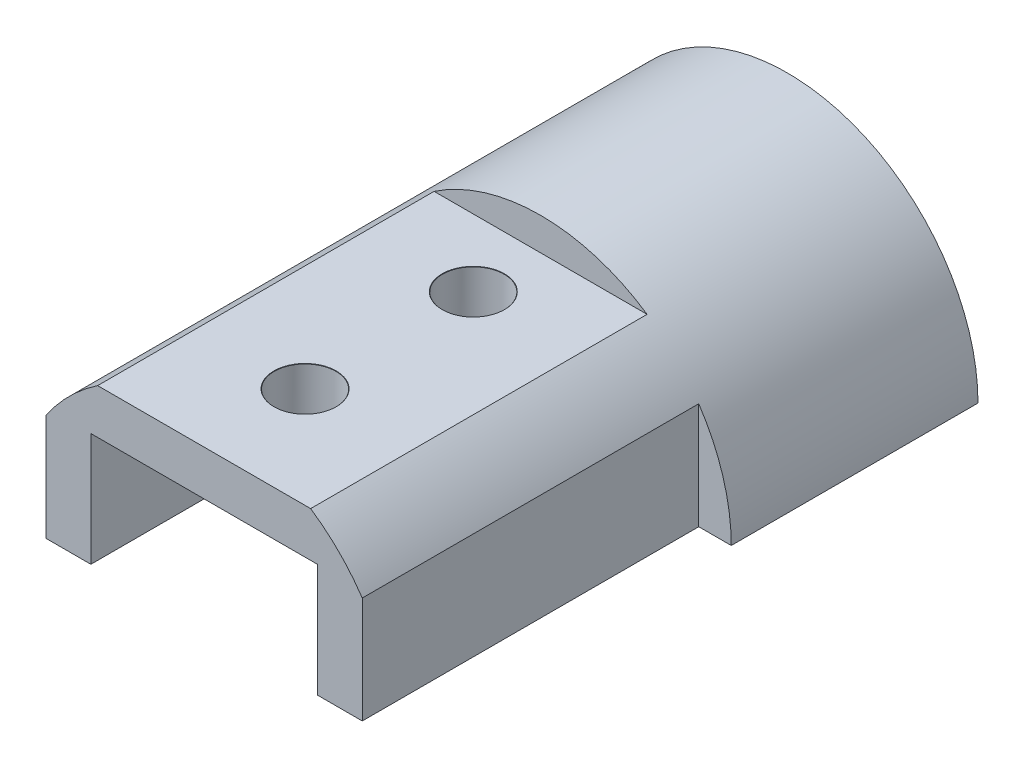
ISO-10303-21;
HEADER;
FILE_DESCRIPTION(('STEP AP214'),'2;1');
FILE_NAME('part.step','',(''),(''),'','','');
FILE_SCHEMA(('AUTOMOTIVE_DESIGN { 1 0 10303 214 1 1 1 1 }'));
ENDSEC;
DATA;
#1=APPLICATION_CONTEXT('core data for automotive mechanical design processes');
#2=APPLICATION_PROTOCOL_DEFINITION('international standard','automotive_design',2000,#1);
#3=PRODUCT_CONTEXT('',#1,'mechanical');
#4=PRODUCT('Part','Part','',(#3));
#5=PRODUCT_RELATED_PRODUCT_CATEGORY('part','',(#4));
#6=PRODUCT_DEFINITION_FORMATION('','',#4);
#7=PRODUCT_DEFINITION_CONTEXT('part definition',#1,'design');
#8=PRODUCT_DEFINITION('design','',#6,#7);
#9=PRODUCT_DEFINITION_SHAPE('','',#8);
#10=(LENGTH_UNIT() NAMED_UNIT(*) SI_UNIT(.MILLI.,.METRE.));
#11=(NAMED_UNIT(*) PLANE_ANGLE_UNIT() SI_UNIT($,.RADIAN.));
#12=(NAMED_UNIT(*) SI_UNIT($,.STERADIAN.) SOLID_ANGLE_UNIT());
#13=UNCERTAINTY_MEASURE_WITH_UNIT(LENGTH_MEASURE(1.E-05),#10,'distance_accuracy_value','');
#14=(GEOMETRIC_REPRESENTATION_CONTEXT(3) GLOBAL_UNCERTAINTY_ASSIGNED_CONTEXT((#13)) GLOBAL_UNIT_ASSIGNED_CONTEXT((#10,
#11,#12)) REPRESENTATION_CONTEXT('',''));
#15=CARTESIAN_POINT('',(0.,0.,0.));
#16=DIRECTION('',(0.,0.,1.));
#17=DIRECTION('',(1.,0.,0.));
#18=AXIS2_PLACEMENT_3D('',#15,#16,#17);
#19=CARTESIAN_POINT('',(0.,0.,22.));
#20=DIRECTION('',(0.,0.,1.));
#21=DIRECTION('',(1.,0.,0.));
#22=AXIS2_PLACEMENT_3D('',#19,#20,#21);
#23=PLANE('',#22);
#24=CARTESIAN_POINT('',(0.,0.,22.));
#25=DIRECTION('',(0.,0.,1.));
#26=DIRECTION('',(1.,0.,0.));
#27=AXIS2_PLACEMENT_3D('',#24,#25,#26);
#28=CIRCLE('',#27,17.);
#29=CARTESIAN_POINT('',(-14.1,9.49684158023077,22.));
#30=VERTEX_POINT('',#29);
#31=CARTESIAN_POINT('',(-17.,0.,22.));
#32=VERTEX_POINT('',#31);
#33=EDGE_CURVE('E419',#30,#32,#28,.T.);
#34=ORIENTED_EDGE('',*,*,#33,.T.);
#35=DIRECTION('',(1.,0.,0.));
#36=VECTOR('',#35,1.);
#37=CARTESIAN_POINT('',(0.,0.,22.));
#38=LINE('',#37,#36);
#39=CARTESIAN_POINT('',(-14.1,0.,22.));
#40=VERTEX_POINT('',#39);
#41=EDGE_CURVE('E555',#32,#40,#38,.T.);
#42=ORIENTED_EDGE('',*,*,#41,.T.);
#43=DIRECTION('',(0.,-1.,0.));
#44=VECTOR('',#43,1.);
#45=CARTESIAN_POINT('',(-14.1,0.,22.));
#46=LINE('',#45,#44);
#47=EDGE_CURVE('E313',#30,#40,#46,.T.);
#48=ORIENTED_EDGE('',*,*,#47,.F.);
#49=EDGE_LOOP('',(#34,#42,#48));
#50=FACE_BOUND('',#49,.T.);
#51=ADVANCED_FACE('F47',(#50),#23,.T.);
#52=CARTESIAN_POINT('',(0.,0.,2.));
#53=DIRECTION('',(0.,0.,-1.));
#54=DIRECTION('',(-1.,0.,0.));
#55=AXIS2_PLACEMENT_3D('',#52,#53,#54);
#56=CYLINDRICAL_SURFACE('',#55,17.);
#57=DIRECTION('',(0.,0.,-1.));
#58=VECTOR('',#57,1.);
#59=CARTESIAN_POINT('',(-17.,0.,2.));
#60=LINE('',#59,#58);
#61=CARTESIAN_POINT('',(-17.,0.,0.));
#62=VERTEX_POINT('',#61);
#63=EDGE_CURVE('E561',#32,#62,#60,.T.);
#64=ORIENTED_EDGE('',*,*,#63,.F.);
#65=ORIENTED_EDGE('',*,*,#33,.F.);
#66=DIRECTION('',(0.,0.,-1.));
#67=VECTOR('',#66,1.);
#68=CARTESIAN_POINT('',(-14.1,9.49684158023077,52.));
#69=LINE('',#68,#67);
#70=CARTESIAN_POINT('',(-14.1,9.49684158023077,52.));
#71=VERTEX_POINT('',#70);
#72=EDGE_CURVE('E356',#71,#30,#69,.T.);
#73=ORIENTED_EDGE('',*,*,#72,.F.);
#74=CARTESIAN_POINT('',(0.,0.,52.));
#75=DIRECTION('',(0.,0.,1.));
#76=DIRECTION('',(1.,0.,0.));
#77=AXIS2_PLACEMENT_3D('',#74,#75,#76);
#78=CIRCLE('',#77,17.);
#79=CARTESIAN_POINT('',(-9.49684158023077,14.1,52.));
#80=VERTEX_POINT('',#79);
#81=EDGE_CURVE('E321',#80,#71,#78,.T.);
#82=ORIENTED_EDGE('',*,*,#81,.F.);
#83=DIRECTION('',(0.,0.,-1.));
#84=VECTOR('',#83,1.);
#85=CARTESIAN_POINT('',(-9.49684158023077,14.1,52.));
#86=LINE('',#85,#84);
#87=CARTESIAN_POINT('',(-9.49684158023077,14.1,22.));
#88=VERTEX_POINT('',#87);
#89=EDGE_CURVE('E359',#80,#88,#86,.T.);
#90=ORIENTED_EDGE('',*,*,#89,.T.);
#91=CARTESIAN_POINT('',(9.49684158023077,14.1,22.));
#92=VERTEX_POINT('',#91);
#93=EDGE_CURVE('E420',#92,#88,#28,.T.);
#94=ORIENTED_EDGE('',*,*,#93,.F.);
#95=DIRECTION('',(0.,0.,-1.));
#96=VECTOR('',#95,1.);
#97=CARTESIAN_POINT('',(9.49684158023077,14.1,52.));
#98=LINE('',#97,#96);
#99=CARTESIAN_POINT('',(9.49684158023077,14.1,52.));
#100=VERTEX_POINT('',#99);
#101=EDGE_CURVE('E363',#100,#92,#98,.T.);
#102=ORIENTED_EDGE('',*,*,#101,.F.);
#103=CARTESIAN_POINT('',(14.1,9.49684158023076,52.));
#104=VERTEX_POINT('',#103);
#105=EDGE_CURVE('E326',#104,#100,#78,.T.);
#106=ORIENTED_EDGE('',*,*,#105,.F.);
#107=DIRECTION('',(0.,0.,-1.));
#108=VECTOR('',#107,1.);
#109=CARTESIAN_POINT('',(14.1,9.49684158023076,52.));
#110=LINE('',#109,#108);
#111=CARTESIAN_POINT('',(14.1,9.49684158023076,22.));
#112=VERTEX_POINT('',#111);
#113=EDGE_CURVE('E366',#104,#112,#110,.T.);
#114=ORIENTED_EDGE('',*,*,#113,.T.);
#115=CARTESIAN_POINT('',(17.,0.,22.));
#116=VERTEX_POINT('',#115);
#117=EDGE_CURVE('E416',#116,#112,#28,.T.);
#118=ORIENTED_EDGE('',*,*,#117,.F.);
#119=DIRECTION('',(0.,0.,-1.));
#120=VECTOR('',#119,1.);
#121=CARTESIAN_POINT('',(17.,0.,2.));
#122=LINE('',#121,#120);
#123=CARTESIAN_POINT('',(17.,0.,0.));
#124=VERTEX_POINT('',#123);
#125=EDGE_CURVE('E939',#124,#116,#122,.F.);
#126=ORIENTED_EDGE('',*,*,#125,.F.);
#127=CARTESIAN_POINT('',(0.,0.,0.));
#128=DIRECTION('',(0.,0.,1.));
#129=DIRECTION('',(1.,0.,0.));
#130=AXIS2_PLACEMENT_3D('',#127,#128,#129);
#131=CIRCLE('',#130,17.);
#132=EDGE_CURVE('E425',#124,#62,#131,.T.);
#133=ORIENTED_EDGE('',*,*,#132,.T.);
#134=EDGE_LOOP('',(#64,#65,#73,#82,#90,#94,#102,#106,#114,#118,#126,#133));
#135=FACE_BOUND('',#134,.T.);
#136=ADVANCED_FACE('F49',(#135),#56,.T.);
#137=CARTESIAN_POINT('',(0.,0.,0.));
#138=DIRECTION('',(0.,0.,1.));
#139=DIRECTION('',(1.,0.,0.));
#140=AXIS2_PLACEMENT_3D('',#137,#138,#139);
#141=PLANE('',#140);
#142=CARTESIAN_POINT('',(-5.65685424949228,5.65685424949238,0.));
#143=DIRECTION('',(0.,0.,1.));
#144=DIRECTION('',(1.,0.,0.));
#145=AXIS2_PLACEMENT_3D('',#142,#143,#144);
#146=CIRCLE('',#145,1.45);
#147=CARTESIAN_POINT('',(-4.20685424949228,5.65685424949238,0.));
#148=VERTEX_POINT('',#147);
#149=EDGE_CURVE('E282',#148,#148,#146,.T.);
#150=ORIENTED_EDGE('',*,*,#149,.T.);
#151=EDGE_LOOP('',(#150));
#152=FACE_BOUND('',#151,.T.);
#153=CARTESIAN_POINT('',(5.65685424949231,5.65685424949245,0.));
#154=DIRECTION('',(0.,0.,1.));
#155=DIRECTION('',(1.,0.,0.));
#156=AXIS2_PLACEMENT_3D('',#153,#154,#155);
#157=CIRCLE('',#156,1.45);
#158=CARTESIAN_POINT('',(7.10685424949231,5.65685424949245,0.));
#159=VERTEX_POINT('',#158);
#160=EDGE_CURVE('E248',#159,#159,#157,.T.);
#161=ORIENTED_EDGE('',*,*,#160,.T.);
#162=EDGE_LOOP('',(#161));
#163=FACE_BOUND('',#162,.T.);
#164=CARTESIAN_POINT('',(0.,8.,0.));
#165=DIRECTION('',(0.,0.,1.));
#166=DIRECTION('',(1.,0.,0.));
#167=AXIS2_PLACEMENT_3D('',#164,#165,#166);
#168=CIRCLE('',#167,1.45);
#169=CARTESIAN_POINT('',(1.45,8.,0.));
#170=VERTEX_POINT('',#169);
#171=EDGE_CURVE('E585',#170,#170,#168,.T.);
#172=ORIENTED_EDGE('',*,*,#171,.T.);
#173=EDGE_LOOP('',(#172));
#174=FACE_BOUND('',#173,.T.);
#175=DIRECTION('',(1.,0.,0.));
#176=VECTOR('',#175,1.);
#177=CARTESIAN_POINT('',(0.,0.,0.));
#178=LINE('',#177,#176);
#179=CARTESIAN_POINT('',(-9.44999999999983,0.,0.));
#180=VERTEX_POINT('',#179);
#181=EDGE_CURVE('E962',#62,#180,#178,.T.);
#182=ORIENTED_EDGE('',*,*,#181,.F.);
#183=ORIENTED_EDGE('',*,*,#132,.F.);
#184=CARTESIAN_POINT('',(9.44999999999993,0.,0.));
#185=VERTEX_POINT('',#184);
#186=EDGE_CURVE('E933',#185,#124,#178,.T.);
#187=ORIENTED_EDGE('',*,*,#186,.F.);
#188=CARTESIAN_POINT('',(7.99999999999993,1.74281395436919E-13,0.));
#189=DIRECTION('',(0.,0.,1.));
#190=DIRECTION('',(1.,0.,0.));
#191=AXIS2_PLACEMENT_3D('',#188,#189,#190);
#192=CIRCLE('',#191,1.45);
#193=CARTESIAN_POINT('',(6.54999999999993,0.,0.));
#194=VERTEX_POINT('',#193);
#195=EDGE_CURVE('E252',#185,#194,#192,.T.);
#196=ORIENTED_EDGE('',*,*,#195,.T.);
#197=CARTESIAN_POINT('',(5.,0.,0.));
#198=VERTEX_POINT('',#197);
#199=EDGE_CURVE('E241',#198,#194,#178,.T.);
#200=ORIENTED_EDGE('',*,*,#199,.F.);
#201=CARTESIAN_POINT('',(0.,0.,0.));
#202=DIRECTION('',(0.,0.,1.));
#203=DIRECTION('',(1.,0.,0.));
#204=AXIS2_PLACEMENT_3D('',#201,#202,#203);
#205=CIRCLE('',#204,5.);
#206=CARTESIAN_POINT('',(-5.,0.,0.));
#207=VERTEX_POINT('',#206);
#208=EDGE_CURVE('E421',#198,#207,#205,.T.);
#209=ORIENTED_EDGE('',*,*,#208,.T.);
#210=CARTESIAN_POINT('',(-6.54999999999983,0.,0.));
#211=VERTEX_POINT('',#210);
#212=EDGE_CURVE('E577',#211,#207,#178,.T.);
#213=ORIENTED_EDGE('',*,*,#212,.F.);
#214=CARTESIAN_POINT('',(-7.99999999999983,0.,0.));
#215=DIRECTION('',(0.,0.,1.));
#216=DIRECTION('',(1.,0.,0.));
#217=AXIS2_PLACEMENT_3D('',#214,#215,#216);
#218=CIRCLE('',#217,1.45);
#219=EDGE_CURVE('E270',#211,#180,#218,.T.);
#220=ORIENTED_EDGE('',*,*,#219,.T.);
#221=EDGE_LOOP('',(#182,#183,#187,#196,#200,#209,#213,#220));
#222=FACE_BOUND('',#221,.T.);
#223=ADVANCED_FACE('F509',(#152,#163,#174,#222),#141,.F.);
#224=CARTESIAN_POINT('',(0.,0.,12.));
#225=DIRECTION('',(0.,0.,-1.));
#226=DIRECTION('',(-1.,0.,0.));
#227=AXIS2_PLACEMENT_3D('',#224,#225,#226);
#228=CYLINDRICAL_SURFACE('',#227,15.);
#229=CARTESIAN_POINT('',(0.,0.,12.));
#230=DIRECTION('',(0.,0.,1.));
#231=DIRECTION('',(1.,0.,0.));
#232=AXIS2_PLACEMENT_3D('',#229,#230,#231);
#233=CIRCLE('',#232,15.);
#234=CARTESIAN_POINT('',(15.,0.,12.));
#235=VERTEX_POINT('',#234);
#236=CARTESIAN_POINT('',(-15.,0.,12.));
#237=VERTEX_POINT('',#236);
#238=EDGE_CURVE('E428',#235,#237,#233,.T.);
#239=ORIENTED_EDGE('',*,*,#238,.T.);
#240=DIRECTION('',(0.,0.,-1.));
#241=VECTOR('',#240,1.);
#242=CARTESIAN_POINT('',(-15.,0.,12.));
#243=LINE('',#242,#241);
#244=CARTESIAN_POINT('',(-15.,0.,2.));
#245=VERTEX_POINT('',#244);
#246=EDGE_CURVE('E959',#237,#245,#243,.T.);
#247=ORIENTED_EDGE('',*,*,#246,.T.);
#248=CARTESIAN_POINT('',(0.,0.,2.));
#249=DIRECTION('',(0.,0.,1.));
#250=DIRECTION('',(1.,0.,0.));
#251=AXIS2_PLACEMENT_3D('',#248,#249,#250);
#252=CIRCLE('',#251,15.);
#253=CARTESIAN_POINT('',(15.,0.,2.));
#254=VERTEX_POINT('',#253);
#255=EDGE_CURVE('E435',#245,#254,#252,.F.);
#256=ORIENTED_EDGE('',*,*,#255,.T.);
#257=DIRECTION('',(0.,0.,-1.));
#258=VECTOR('',#257,1.);
#259=CARTESIAN_POINT('',(15.,0.,12.));
#260=LINE('',#259,#258);
#261=EDGE_CURVE('E935',#254,#235,#260,.F.);
#262=ORIENTED_EDGE('',*,*,#261,.T.);
#263=EDGE_LOOP('',(#239,#247,#256,#262));
#264=FACE_BOUND('',#263,.T.);
#265=ADVANCED_FACE('F607',(#264),#228,.F.);
#266=CARTESIAN_POINT('',(0.,0.,2.));
#267=DIRECTION('',(0.,0.,1.));
#268=DIRECTION('',(1.,0.,0.));
#269=AXIS2_PLACEMENT_3D('',#266,#267,#268);
#270=PLANE('',#269);
#271=CARTESIAN_POINT('',(-5.65685424949228,5.65685424949238,2.));
#272=DIRECTION('',(0.,0.,1.));
#273=DIRECTION('',(1.,0.,0.));
#274=AXIS2_PLACEMENT_3D('',#271,#272,#273);
#275=CIRCLE('',#274,1.475);
#276=CARTESIAN_POINT('',(-4.18185424949228,5.65685424949238,2.));
#277=VERTEX_POINT('',#276);
#278=EDGE_CURVE('E274',#277,#277,#275,.T.);
#279=ORIENTED_EDGE('',*,*,#278,.F.);
#280=EDGE_LOOP('',(#279));
#281=FACE_BOUND('',#280,.T.);
#282=CARTESIAN_POINT('',(5.65685424949231,5.65685424949245,2.));
#283=DIRECTION('',(0.,0.,1.));
#284=DIRECTION('',(1.,0.,0.));
#285=AXIS2_PLACEMENT_3D('',#282,#283,#284);
#286=CIRCLE('',#285,1.475);
#287=CARTESIAN_POINT('',(7.13185424949231,5.65685424949245,2.));
#288=VERTEX_POINT('',#287);
#289=EDGE_CURVE('E589',#288,#288,#286,.T.);
#290=ORIENTED_EDGE('',*,*,#289,.F.);
#291=EDGE_LOOP('',(#290));
#292=FACE_BOUND('',#291,.T.);
#293=CARTESIAN_POINT('',(0.,8.,2.));
#294=DIRECTION('',(0.,0.,1.));
#295=DIRECTION('',(1.,0.,0.));
#296=AXIS2_PLACEMENT_3D('',#293,#294,#295);
#297=CIRCLE('',#296,1.475);
#298=CARTESIAN_POINT('',(1.475,8.,2.));
#299=VERTEX_POINT('',#298);
#300=EDGE_CURVE('E576',#299,#299,#297,.T.);
#301=ORIENTED_EDGE('',*,*,#300,.F.);
#302=EDGE_LOOP('',(#301));
#303=FACE_BOUND('',#302,.T.);
#304=ORIENTED_EDGE('',*,*,#255,.F.);
#305=DIRECTION('',(1.,0.,0.));
#306=VECTOR('',#305,1.);
#307=CARTESIAN_POINT('',(0.,0.,2.));
#308=LINE('',#307,#306);
#309=CARTESIAN_POINT('',(-9.47499999999983,0.,2.));
#310=VERTEX_POINT('',#309);
#311=EDGE_CURVE('E923',#245,#310,#308,.T.);
#312=ORIENTED_EDGE('',*,*,#311,.T.);
#313=CARTESIAN_POINT('',(-7.99999999999983,0.,2.));
#314=DIRECTION('',(0.,0.,1.));
#315=DIRECTION('',(1.,0.,0.));
#316=AXIS2_PLACEMENT_3D('',#313,#314,#315);
#317=CIRCLE('',#316,1.475);
#318=CARTESIAN_POINT('',(-6.52499999999983,0.,2.));
#319=VERTEX_POINT('',#318);
#320=EDGE_CURVE('E262',#319,#310,#317,.T.);
#321=ORIENTED_EDGE('',*,*,#320,.F.);
#322=CARTESIAN_POINT('',(-5.,0.,2.));
#323=VERTEX_POINT('',#322);
#324=EDGE_CURVE('E63',#319,#323,#308,.T.);
#325=ORIENTED_EDGE('',*,*,#324,.T.);
#326=CARTESIAN_POINT('',(0.,0.,2.));
#327=DIRECTION('',(0.,0.,1.));
#328=DIRECTION('',(1.,0.,0.));
#329=AXIS2_PLACEMENT_3D('',#326,#327,#328);
#330=CIRCLE('',#329,5.);
#331=CARTESIAN_POINT('',(5.,0.,2.));
#332=VERTEX_POINT('',#331);
#333=EDGE_CURVE('E239',#332,#323,#330,.T.);
#334=ORIENTED_EDGE('',*,*,#333,.F.);
#335=CARTESIAN_POINT('',(6.52499999999993,0.,2.));
#336=VERTEX_POINT('',#335);
#337=EDGE_CURVE('E221',#332,#336,#308,.T.);
#338=ORIENTED_EDGE('',*,*,#337,.T.);
#339=CARTESIAN_POINT('',(7.99999999999993,1.74281395436919E-13,2.));
#340=DIRECTION('',(0.,0.,1.));
#341=DIRECTION('',(1.,0.,0.));
#342=AXIS2_PLACEMENT_3D('',#339,#340,#341);
#343=CIRCLE('',#342,1.475);
#344=CARTESIAN_POINT('',(9.47499999999993,0.,2.));
#345=VERTEX_POINT('',#344);
#346=EDGE_CURVE('E237',#345,#336,#343,.T.);
#347=ORIENTED_EDGE('',*,*,#346,.F.);
#348=EDGE_CURVE('E243',#345,#254,#308,.T.);
#349=ORIENTED_EDGE('',*,*,#348,.T.);
#350=EDGE_LOOP('',(#304,#312,#321,#325,#334,#338,#347,#349));
#351=FACE_BOUND('',#350,.T.);
#352=ADVANCED_FACE('F235',(#281,#292,#303,#351),#270,.T.);
#353=CARTESIAN_POINT('',(0.,0.,0.));
#354=DIRECTION('',(0.,0.,1.));
#355=DIRECTION('',(1.,0.,0.));
#356=AXIS2_PLACEMENT_3D('',#353,#354,#355);
#357=CYLINDRICAL_SURFACE('',#356,5.);
#358=DIRECTION('',(0.,0.,1.));
#359=VECTOR('',#358,1.);
#360=CARTESIAN_POINT('',(5.,0.,0.));
#361=LINE('',#360,#359);
#362=EDGE_CURVE('E924',#332,#198,#361,.F.);
#363=ORIENTED_EDGE('',*,*,#362,.F.);
#364=ORIENTED_EDGE('',*,*,#333,.T.);
#365=DIRECTION('',(0.,0.,1.));
#366=VECTOR('',#365,1.);
#367=CARTESIAN_POINT('',(-5.,0.,0.));
#368=LINE('',#367,#366);
#369=EDGE_CURVE('E573',#207,#323,#368,.T.);
#370=ORIENTED_EDGE('',*,*,#369,.F.);
#371=ORIENTED_EDGE('',*,*,#208,.F.);
#372=EDGE_LOOP('',(#363,#364,#370,#371));
#373=FACE_BOUND('',#372,.T.);
#374=ADVANCED_FACE('F520',(#373),#357,.F.);
#375=CARTESIAN_POINT('',(0.,0.,12.));
#376=DIRECTION('',(0.,0.,1.));
#377=DIRECTION('',(1.,0.,0.));
#378=AXIS2_PLACEMENT_3D('',#375,#376,#377);
#379=PLANE('',#378);
#380=DIRECTION('',(1.,0.,0.));
#381=VECTOR('',#380,1.);
#382=CARTESIAN_POINT('',(0.,0.,12.));
#383=LINE('',#382,#381);
#384=CARTESIAN_POINT('',(-10.1,0.,12.));
#385=VERTEX_POINT('',#384);
#386=EDGE_CURVE('E554',#237,#385,#383,.T.);
#387=ORIENTED_EDGE('',*,*,#386,.F.);
#388=ORIENTED_EDGE('',*,*,#238,.F.);
#389=CARTESIAN_POINT('',(10.1,0.,12.));
#390=VERTEX_POINT('',#389);
#391=EDGE_CURVE('E560',#390,#235,#383,.T.);
#392=ORIENTED_EDGE('',*,*,#391,.F.);
#393=DIRECTION('',(0.,1.,0.));
#394=VECTOR('',#393,1.);
#395=CARTESIAN_POINT('',(10.1,4.44314575050765,12.));
#396=LINE('',#395,#394);
#397=CARTESIAN_POINT('',(10.1,4.44314575050765,12.));
#398=VERTEX_POINT('',#397);
#399=EDGE_CURVE('E392',#390,#398,#396,.T.);
#400=ORIENTED_EDGE('',*,*,#399,.T.);
#401=DIRECTION('',(-0.707106781186551,0.707106781186544,0.));
#402=VECTOR('',#401,1.);
#403=CARTESIAN_POINT('',(4.44314575050759,10.1,12.));
#404=LINE('',#403,#402);
#405=CARTESIAN_POINT('',(4.44314575050759,10.1,12.));
#406=VERTEX_POINT('',#405);
#407=EDGE_CURVE('E395',#398,#406,#404,.T.);
#408=ORIENTED_EDGE('',*,*,#407,.T.);
#409=DIRECTION('',(-1.,0.,0.));
#410=VECTOR('',#409,1.);
#411=CARTESIAN_POINT('',(-4.44314575050759,10.1,12.));
#412=LINE('',#411,#410);
#413=CARTESIAN_POINT('',(-4.44314575050759,10.1,12.));
#414=VERTEX_POINT('',#413);
#415=EDGE_CURVE('E380',#406,#414,#412,.T.);
#416=ORIENTED_EDGE('',*,*,#415,.T.);
#417=DIRECTION('',(-0.707106781186551,-0.707106781186544,0.));
#418=VECTOR('',#417,1.);
#419=CARTESIAN_POINT('',(-4.44314575050759,10.1,12.));
#420=LINE('',#419,#418);
#421=CARTESIAN_POINT('',(-10.1,4.44314575050765,12.));
#422=VERTEX_POINT('',#421);
#423=EDGE_CURVE('E370',#414,#422,#420,.T.);
#424=ORIENTED_EDGE('',*,*,#423,.T.);
#425=DIRECTION('',(0.,-1.,0.));
#426=VECTOR('',#425,1.);
#427=CARTESIAN_POINT('',(-10.1,4.44314575050765,12.));
#428=LINE('',#427,#426);
#429=EDGE_CURVE('E388',#422,#385,#428,.T.);
#430=ORIENTED_EDGE('',*,*,#429,.T.);
#431=EDGE_LOOP('',(#387,#388,#392,#400,#408,#416,#424,#430));
#432=FACE_BOUND('',#431,.T.);
#433=ADVANCED_FACE('F461',(#432),#379,.F.);
#434=DIRECTION('',(0.,1.,0.));
#435=VECTOR('',#434,1.);
#436=CARTESIAN_POINT('',(14.1,0.,22.));
#437=LINE('',#436,#435);
#438=CARTESIAN_POINT('',(14.1,0.,22.));
#439=VERTEX_POINT('',#438);
#440=EDGE_CURVE('E341',#439,#112,#437,.T.);
#441=ORIENTED_EDGE('',*,*,#440,.F.);
#442=DIRECTION('',(1.,0.,0.));
#443=VECTOR('',#442,1.);
#444=CARTESIAN_POINT('',(0.,0.,22.));
#445=LINE('',#444,#443);
#446=EDGE_CURVE('E523',#439,#116,#445,.T.);
#447=ORIENTED_EDGE('',*,*,#446,.T.);
#448=ORIENTED_EDGE('',*,*,#117,.T.);
#449=EDGE_LOOP('',(#441,#447,#448));
#450=FACE_BOUND('',#449,.T.);
#451=ADVANCED_FACE('F500',(#450),#23,.T.);
#452=CARTESIAN_POINT('',(-10.1,4.44314575050765,22.));
#453=DIRECTION('',(1.,0.,0.));
#454=DIRECTION('',(0.,0.,-1.));
#455=AXIS2_PLACEMENT_3D('',#452,#453,#454);
#456=PLANE('',#455);
#457=DIRECTION('',(0.,-1.,0.));
#458=VECTOR('',#457,1.);
#459=CARTESIAN_POINT('',(-10.1,0.,52.));
#460=LINE('',#459,#458);
#461=CARTESIAN_POINT('',(-10.1,10.1,52.));
#462=VERTEX_POINT('',#461);
#463=CARTESIAN_POINT('',(-10.1,0.,52.));
#464=VERTEX_POINT('',#463);
#465=EDGE_CURVE('E308',#462,#464,#460,.T.);
#466=ORIENTED_EDGE('',*,*,#465,.T.);
#467=DIRECTION('',(0.,0.,-1.));
#468=VECTOR('',#467,1.);
#469=CARTESIAN_POINT('',(-10.1,0.,22.));
#470=LINE('',#469,#468);
#471=EDGE_CURVE('E482',#464,#385,#470,.T.);
#472=ORIENTED_EDGE('',*,*,#471,.T.);
#473=ORIENTED_EDGE('',*,*,#429,.F.);
#474=DIRECTION('',(0.,0.,-1.));
#475=VECTOR('',#474,1.);
#476=CARTESIAN_POINT('',(-10.1,4.44314575050765,22.));
#477=LINE('',#476,#475);
#478=CARTESIAN_POINT('',(-10.1,4.44314575050765,22.));
#479=VERTEX_POINT('',#478);
#480=EDGE_CURVE('E412',#479,#422,#477,.T.);
#481=ORIENTED_EDGE('',*,*,#480,.F.);
#482=DIRECTION('',(0.,-1.,0.));
#483=VECTOR('',#482,1.);
#484=CARTESIAN_POINT('',(-10.1,0.,22.));
#485=LINE('',#484,#483);
#486=CARTESIAN_POINT('',(-10.1,10.1,22.));
#487=VERTEX_POINT('',#486);
#488=EDGE_CURVE('E307',#487,#479,#485,.T.);
#489=ORIENTED_EDGE('',*,*,#488,.F.);
#490=DIRECTION('',(0.,0.,-1.));
#491=VECTOR('',#490,1.);
#492=CARTESIAN_POINT('',(-10.1,10.1,52.));
#493=LINE('',#492,#491);
#494=EDGE_CURVE('E360',#462,#487,#493,.T.);
#495=ORIENTED_EDGE('',*,*,#494,.F.);
#496=EDGE_LOOP('',(#466,#472,#473,#481,#489,#495));
#497=FACE_BOUND('',#496,.T.);
#498=ADVANCED_FACE('F481',(#497),#456,.T.);
#499=CARTESIAN_POINT('',(10.1,4.44314575050765,22.));
#500=DIRECTION('',(-1.,0.,0.));
#501=DIRECTION('',(0.,0.,1.));
#502=AXIS2_PLACEMENT_3D('',#499,#500,#501);
#503=PLANE('',#502);
#504=ORIENTED_EDGE('',*,*,#399,.F.);
#505=DIRECTION('',(0.,0.,1.));
#506=VECTOR('',#505,1.);
#507=CARTESIAN_POINT('',(10.1,0.,22.));
#508=LINE('',#507,#506);
#509=CARTESIAN_POINT('',(10.1,0.,52.));
#510=VERTEX_POINT('',#509);
#511=EDGE_CURVE('E947',#390,#510,#508,.T.);
#512=ORIENTED_EDGE('',*,*,#511,.T.);
#513=DIRECTION('',(0.,1.,0.));
#514=VECTOR('',#513,1.);
#515=CARTESIAN_POINT('',(10.1,0.,52.));
#516=LINE('',#515,#514);
#517=CARTESIAN_POINT('',(10.1,10.1,52.));
#518=VERTEX_POINT('',#517);
#519=EDGE_CURVE('E317',#510,#518,#516,.T.);
#520=ORIENTED_EDGE('',*,*,#519,.T.);
#521=DIRECTION('',(0.,0.,-1.));
#522=VECTOR('',#521,1.);
#523=CARTESIAN_POINT('',(10.1,10.1,52.));
#524=LINE('',#523,#522);
#525=CARTESIAN_POINT('',(10.1,10.1,22.));
#526=VERTEX_POINT('',#525);
#527=EDGE_CURVE('E335',#518,#526,#524,.T.);
#528=ORIENTED_EDGE('',*,*,#527,.T.);
#529=DIRECTION('',(0.,1.,0.));
#530=VECTOR('',#529,1.);
#531=CARTESIAN_POINT('',(10.1,0.,22.));
#532=LINE('',#531,#530);
#533=CARTESIAN_POINT('',(10.1,4.44314575050765,22.));
#534=VERTEX_POINT('',#533);
#535=EDGE_CURVE('E230',#534,#526,#532,.T.);
#536=ORIENTED_EDGE('',*,*,#535,.F.);
#537=DIRECTION('',(0.,0.,-1.));
#538=VECTOR('',#537,1.);
#539=CARTESIAN_POINT('',(10.1,4.44314575050765,22.));
#540=LINE('',#539,#538);
#541=EDGE_CURVE('E408',#534,#398,#540,.T.);
#542=ORIENTED_EDGE('',*,*,#541,.T.);
#543=EDGE_LOOP('',(#504,#512,#520,#528,#536,#542));
#544=FACE_BOUND('',#543,.T.);
#545=ADVANCED_FACE('F518',(#544),#503,.T.);
#546=CARTESIAN_POINT('',(14.1,0.,52.));
#547=DIRECTION('',(-1.,0.,0.));
#548=DIRECTION('',(0.,-1.,0.));
#549=AXIS2_PLACEMENT_3D('',#546,#547,#548);
#550=PLANE('',#549);
#551=DIRECTION('',(0.,0.,1.));
#552=VECTOR('',#551,1.);
#553=CARTESIAN_POINT('',(14.1,0.,52.));
#554=LINE('',#553,#552);
#555=CARTESIAN_POINT('',(14.1,0.,52.));
#556=VERTEX_POINT('',#555);
#557=EDGE_CURVE('E531',#439,#556,#554,.T.);
#558=ORIENTED_EDGE('',*,*,#557,.F.);
#559=ORIENTED_EDGE('',*,*,#440,.T.);
#560=ORIENTED_EDGE('',*,*,#113,.F.);
#561=DIRECTION('',(0.,1.,0.));
#562=VECTOR('',#561,1.);
#563=CARTESIAN_POINT('',(14.1,0.,52.));
#564=LINE('',#563,#562);
#565=EDGE_CURVE('E320',#556,#104,#564,.T.);
#566=ORIENTED_EDGE('',*,*,#565,.F.);
#567=EDGE_LOOP('',(#558,#559,#560,#566));
#568=FACE_BOUND('',#567,.T.);
#569=ADVANCED_FACE('F528',(#568),#550,.F.);
#570=CARTESIAN_POINT('',(-14.1,0.,52.));
#571=DIRECTION('',(1.,0.,0.));
#572=DIRECTION('',(0.,1.,0.));
#573=AXIS2_PLACEMENT_3D('',#570,#571,#572);
#574=PLANE('',#573);
#575=DIRECTION('',(0.,0.,-1.));
#576=VECTOR('',#575,1.);
#577=CARTESIAN_POINT('',(-14.1,0.,52.));
#578=LINE('',#577,#576);
#579=CARTESIAN_POINT('',(-14.1,0.,52.));
#580=VERTEX_POINT('',#579);
#581=EDGE_CURVE('E551',#580,#40,#578,.T.);
#582=ORIENTED_EDGE('',*,*,#581,.F.);
#583=DIRECTION('',(0.,-1.,0.));
#584=VECTOR('',#583,1.);
#585=CARTESIAN_POINT('',(-14.1,0.,52.));
#586=LINE('',#585,#584);
#587=EDGE_CURVE('E324',#71,#580,#586,.T.);
#588=ORIENTED_EDGE('',*,*,#587,.F.);
#589=ORIENTED_EDGE('',*,*,#72,.T.);
#590=ORIENTED_EDGE('',*,*,#47,.T.);
#591=EDGE_LOOP('',(#582,#588,#589,#590));
#592=FACE_BOUND('',#591,.T.);
#593=ADVANCED_FACE('F550',(#592),#574,.F.);
#594=CARTESIAN_POINT('',(0.,0.,52.));
#595=DIRECTION('',(0.,0.,1.));
#596=DIRECTION('',(1.,0.,0.));
#597=AXIS2_PLACEMENT_3D('',#594,#595,#596);
#598=PLANE('',#597);
#599=ORIENTED_EDGE('',*,*,#587,.T.);
#600=DIRECTION('',(1.,0.,0.));
#601=VECTOR('',#600,1.);
#602=CARTESIAN_POINT('',(0.,0.,52.));
#603=LINE('',#602,#601);
#604=EDGE_CURVE('E478',#580,#464,#603,.T.);
#605=ORIENTED_EDGE('',*,*,#604,.T.);
#606=ORIENTED_EDGE('',*,*,#465,.F.);
#607=DIRECTION('',(-1.,0.,0.));
#608=VECTOR('',#607,1.);
#609=CARTESIAN_POINT('',(0.,10.1,52.));
#610=LINE('',#609,#608);
#611=EDGE_CURVE('E312',#518,#462,#610,.T.);
#612=ORIENTED_EDGE('',*,*,#611,.F.);
#613=ORIENTED_EDGE('',*,*,#519,.F.);
#614=EDGE_CURVE('E951',#510,#556,#603,.T.);
#615=ORIENTED_EDGE('',*,*,#614,.T.);
#616=ORIENTED_EDGE('',*,*,#565,.T.);
#617=ORIENTED_EDGE('',*,*,#105,.T.);
#618=DIRECTION('',(1.,0.,0.));
#619=VECTOR('',#618,1.);
#620=CARTESIAN_POINT('',(0.,14.1,52.));
#621=LINE('',#620,#619);
#622=EDGE_CURVE('E325',#80,#100,#621,.T.);
#623=ORIENTED_EDGE('',*,*,#622,.F.);
#624=ORIENTED_EDGE('',*,*,#81,.T.);
#625=EDGE_LOOP('',(#599,#605,#606,#612,#613,#615,#616,#617,#623,#624));
#626=FACE_BOUND('',#625,.T.);
#627=ADVANCED_FACE('F475',(#626),#598,.T.);
#628=CARTESIAN_POINT('',(-7.99999999999983,0.,2.));
#629=DIRECTION('',(0.,0.,1.));
#630=DIRECTION('',(1.,0.,0.));
#631=AXIS2_PLACEMENT_3D('',#628,#629,#630);
#632=CYLINDRICAL_SURFACE('',#631,1.45);
#633=DIRECTION('',(0.,0.,1.));
#634=VECTOR('',#633,1.);
#635=CARTESIAN_POINT('',(-6.54999999999983,0.,2.));
#636=LINE('',#635,#634);
#637=CARTESIAN_POINT('',(-6.54999999999983,0.,1.975));
#638=VERTEX_POINT('',#637);
#639=EDGE_CURVE('E570',#638,#211,#636,.F.);
#640=ORIENTED_EDGE('',*,*,#639,.F.);
#641=CARTESIAN_POINT('',(-7.99999999999983,0.,1.975));
#642=DIRECTION('',(0.,0.,1.));
#643=DIRECTION('',(1.,0.,0.));
#644=AXIS2_PLACEMENT_3D('',#641,#642,#643);
#645=CIRCLE('',#644,1.45);
#646=CARTESIAN_POINT('',(-9.44999999999983,0.,1.975));
#647=VERTEX_POINT('',#646);
#648=EDGE_CURVE('E266',#638,#647,#645,.T.);
#649=ORIENTED_EDGE('',*,*,#648,.T.);
#650=DIRECTION('',(0.,0.,1.));
#651=VECTOR('',#650,1.);
#652=CARTESIAN_POINT('',(-9.44999999999983,0.,2.));
#653=LINE('',#652,#651);
#654=EDGE_CURVE('E71',#180,#647,#653,.T.);
#655=ORIENTED_EDGE('',*,*,#654,.F.);
#656=ORIENTED_EDGE('',*,*,#219,.F.);
#657=EDGE_LOOP('',(#640,#649,#655,#656));
#658=FACE_BOUND('',#657,.T.);
#659=ADVANCED_FACE('F639',(#658),#632,.F.);
#660=CARTESIAN_POINT('',(-7.99999999999983,0.,2.));
#661=DIRECTION('',(0.,0.,1.));
#662=DIRECTION('',(1.,0.,0.));
#663=AXIS2_PLACEMENT_3D('',#660,#661,#662);
#664=CONICAL_SURFACE('',#663,1.475,0.785398163397466);
#665=DIRECTION('',(0.70710678118656,0.,0.707106781186535));
#666=VECTOR('',#665,1.);
#667=CARTESIAN_POINT('',(-7.99999999999983,0.,0.525000000000051));
#668=LINE('',#667,#666);
#669=EDGE_CURVE('E567',#319,#638,#668,.F.);
#670=ORIENTED_EDGE('',*,*,#669,.F.);
#671=ORIENTED_EDGE('',*,*,#320,.T.);
#672=DIRECTION('',(0.70710678118656,0.,-0.707106781186535));
#673=VECTOR('',#672,1.);
#674=CARTESIAN_POINT('',(-7.99999999999983,0.,0.525000000000051));
#675=LINE('',#674,#673);
#676=EDGE_CURVE('E954',#647,#310,#675,.F.);
#677=ORIENTED_EDGE('',*,*,#676,.F.);
#678=ORIENTED_EDGE('',*,*,#648,.F.);
#679=EDGE_LOOP('',(#670,#671,#677,#678));
#680=FACE_BOUND('',#679,.T.);
#681=ADVANCED_FACE('F635',(#680),#664,.F.);
#682=CARTESIAN_POINT('',(7.99999999999993,1.74281395436919E-13,2.));
#683=DIRECTION('',(0.,0.,1.));
#684=DIRECTION('',(1.,0.,0.));
#685=AXIS2_PLACEMENT_3D('',#682,#683,#684);
#686=CYLINDRICAL_SURFACE('',#685,1.45);
#687=DIRECTION('',(0.,0.,1.));
#688=VECTOR('',#687,1.);
#689=CARTESIAN_POINT('',(9.44999999999993,0.,2.));
#690=LINE('',#689,#688);
#691=CARTESIAN_POINT('',(9.44999999999993,0.,1.975));
#692=VERTEX_POINT('',#691);
#693=EDGE_CURVE('E927',#692,#185,#690,.F.);
#694=ORIENTED_EDGE('',*,*,#693,.F.);
#695=CARTESIAN_POINT('',(7.99999999999993,1.74281395436919E-13,1.975));
#696=DIRECTION('',(0.,0.,1.));
#697=DIRECTION('',(1.,0.,0.));
#698=AXIS2_PLACEMENT_3D('',#695,#696,#697);
#699=CIRCLE('',#698,1.45);
#700=CARTESIAN_POINT('',(6.54999999999993,0.,1.975));
#701=VERTEX_POINT('',#700);
#702=EDGE_CURVE('E247',#692,#701,#699,.T.);
#703=ORIENTED_EDGE('',*,*,#702,.T.);
#704=DIRECTION('',(0.,0.,1.));
#705=VECTOR('',#704,1.);
#706=CARTESIAN_POINT('',(6.54999999999993,0.,2.));
#707=LINE('',#706,#705);
#708=EDGE_CURVE('E224',#194,#701,#707,.T.);
#709=ORIENTED_EDGE('',*,*,#708,.F.);
#710=ORIENTED_EDGE('',*,*,#195,.F.);
#711=EDGE_LOOP('',(#694,#703,#709,#710));
#712=FACE_BOUND('',#711,.T.);
#713=ADVANCED_FACE('F632',(#712),#686,.F.);
#714=CARTESIAN_POINT('',(7.99999999999993,1.74281395436919E-13,2.));
#715=DIRECTION('',(0.,0.,1.));
#716=DIRECTION('',(1.,0.,0.));
#717=AXIS2_PLACEMENT_3D('',#714,#715,#716);
#718=CONICAL_SURFACE('',#717,1.475,0.785398163397466);
#719=DIRECTION('',(0.70710678118656,0.,0.707106781186535));
#720=VECTOR('',#719,1.);
#721=CARTESIAN_POINT('',(7.99999999999993,0.,0.525000000000051));
#722=LINE('',#721,#720);
#723=EDGE_CURVE('E11',#345,#692,#722,.F.);
#724=ORIENTED_EDGE('',*,*,#723,.F.);
#725=ORIENTED_EDGE('',*,*,#346,.T.);
#726=DIRECTION('',(0.70710678118656,0.,-0.707106781186535));
#727=VECTOR('',#726,1.);
#728=CARTESIAN_POINT('',(7.99999999999993,0.,0.525000000000051));
#729=LINE('',#728,#727);
#730=EDGE_CURVE('E56',#701,#336,#729,.F.);
#731=ORIENTED_EDGE('',*,*,#730,.F.);
#732=ORIENTED_EDGE('',*,*,#702,.F.);
#733=EDGE_LOOP('',(#724,#725,#731,#732));
#734=FACE_BOUND('',#733,.T.);
#735=ADVANCED_FACE('F245',(#734),#718,.F.);
#736=DIRECTION('',(-0.707106781186551,0.707106781186544,0.));
#737=VECTOR('',#736,1.);
#738=CARTESIAN_POINT('',(4.44314575050759,10.1,22.));
#739=LINE('',#738,#737);
#740=CARTESIAN_POINT('',(4.44314575050759,10.1,22.));
#741=VERTEX_POINT('',#740);
#742=EDGE_CURVE('E379',#534,#741,#739,.T.);
#743=ORIENTED_EDGE('',*,*,#742,.F.);
#744=ORIENTED_EDGE('',*,*,#535,.T.);
#745=DIRECTION('',(-1.,0.,0.));
#746=VECTOR('',#745,1.);
#747=CARTESIAN_POINT('',(0.,10.1,22.));
#748=LINE('',#747,#746);
#749=EDGE_CURVE('E338',#526,#741,#748,.T.);
#750=ORIENTED_EDGE('',*,*,#749,.T.);
#751=EDGE_LOOP('',(#743,#744,#750));
#752=FACE_BOUND('',#751,.T.);
#753=ADVANCED_FACE('F468',(#752),#23,.T.);
#754=DIRECTION('',(-0.707106781186551,-0.707106781186544,0.));
#755=VECTOR('',#754,1.);
#756=CARTESIAN_POINT('',(-4.44314575050759,10.1,22.));
#757=LINE('',#756,#755);
#758=CARTESIAN_POINT('',(-4.44314575050759,10.1,22.));
#759=VERTEX_POINT('',#758);
#760=EDGE_CURVE('E375',#759,#479,#757,.T.);
#761=ORIENTED_EDGE('',*,*,#760,.F.);
#762=EDGE_CURVE('E342',#759,#487,#748,.T.);
#763=ORIENTED_EDGE('',*,*,#762,.T.);
#764=ORIENTED_EDGE('',*,*,#488,.T.);
#765=EDGE_LOOP('',(#761,#763,#764));
#766=FACE_BOUND('',#765,.T.);
#767=ADVANCED_FACE('F491',(#766),#23,.T.);
#768=ORIENTED_EDGE('',*,*,#93,.T.);
#769=DIRECTION('',(1.,0.,0.));
#770=VECTOR('',#769,1.);
#771=CARTESIAN_POINT('',(0.,14.1,22.));
#772=LINE('',#771,#770);
#773=EDGE_CURVE('E349',#88,#92,#772,.T.);
#774=ORIENTED_EDGE('',*,*,#773,.T.);
#775=EDGE_LOOP('',(#768,#774));
#776=FACE_BOUND('',#775,.T.);
#777=ADVANCED_FACE('F493',(#776),#23,.T.);
#778=CARTESIAN_POINT('',(-4.44314575050759,10.1,22.));
#779=DIRECTION('',(0.707106781186544,-0.707106781186551,0.));
#780=DIRECTION('',(0.707106781186551,0.707106781186544,0.));
#781=AXIS2_PLACEMENT_3D('',#778,#779,#780);
#782=PLANE('',#781);
#783=ORIENTED_EDGE('',*,*,#423,.F.);
#784=DIRECTION('',(0.,0.,-1.));
#785=VECTOR('',#784,1.);
#786=CARTESIAN_POINT('',(-4.44314575050759,10.1,22.));
#787=LINE('',#786,#785);
#788=EDGE_CURVE('E384',#759,#414,#787,.T.);
#789=ORIENTED_EDGE('',*,*,#788,.F.);
#790=ORIENTED_EDGE('',*,*,#760,.T.);
#791=ORIENTED_EDGE('',*,*,#480,.T.);
#792=EDGE_LOOP('',(#783,#789,#790,#791));
#793=FACE_BOUND('',#792,.T.);
#794=ADVANCED_FACE('F490',(#793),#782,.T.);
#795=CARTESIAN_POINT('',(4.44314575050759,10.1,22.));
#796=DIRECTION('',(-0.707106781186544,-0.707106781186551,0.));
#797=DIRECTION('',(0.707106781186551,-0.707106781186544,0.));
#798=AXIS2_PLACEMENT_3D('',#795,#796,#797);
#799=PLANE('',#798);
#800=ORIENTED_EDGE('',*,*,#407,.F.);
#801=ORIENTED_EDGE('',*,*,#541,.F.);
#802=ORIENTED_EDGE('',*,*,#742,.T.);
#803=DIRECTION('',(0.,0.,-1.));
#804=VECTOR('',#803,1.);
#805=CARTESIAN_POINT('',(4.44314575050759,10.1,22.));
#806=LINE('',#805,#804);
#807=EDGE_CURVE('E405',#741,#406,#806,.T.);
#808=ORIENTED_EDGE('',*,*,#807,.T.);
#809=EDGE_LOOP('',(#800,#801,#802,#808));
#810=FACE_BOUND('',#809,.T.);
#811=ADVANCED_FACE('F450',(#810),#799,.T.);
#812=CARTESIAN_POINT('',(-4.44314575050759,10.1,22.));
#813=DIRECTION('',(0.,-1.,0.));
#814=DIRECTION('',(0.,0.,-1.));
#815=AXIS2_PLACEMENT_3D('',#812,#813,#814);
#816=PLANE('',#815);
#817=CARTESIAN_POINT('',(0.,10.1,28.));
#818=DIRECTION('',(0.,-1.,0.));
#819=DIRECTION('',(0.,0.,-1.));
#820=AXIS2_PLACEMENT_3D('',#817,#818,#819);
#821=CIRCLE('',#820,2.74999999999999);
#822=CARTESIAN_POINT('',(0.,10.1,25.25));
#823=VERTEX_POINT('',#822);
#824=EDGE_CURVE('E294',#823,#823,#821,.T.);
#825=ORIENTED_EDGE('',*,*,#824,.F.);
#826=EDGE_LOOP('',(#825));
#827=FACE_BOUND('',#826,.T.);
#828=CARTESIAN_POINT('',(0.,10.1,43.));
#829=DIRECTION('',(0.,-1.,0.));
#830=DIRECTION('',(0.,0.,-1.));
#831=AXIS2_PLACEMENT_3D('',#828,#829,#830);
#832=CIRCLE('',#831,2.74999999999999);
#833=CARTESIAN_POINT('',(0.,10.1,40.25));
#834=VERTEX_POINT('',#833);
#835=EDGE_CURVE('E303',#834,#834,#832,.T.);
#836=ORIENTED_EDGE('',*,*,#835,.F.);
#837=EDGE_LOOP('',(#836));
#838=FACE_BOUND('',#837,.T.);
#839=ORIENTED_EDGE('',*,*,#415,.F.);
#840=ORIENTED_EDGE('',*,*,#807,.F.);
#841=ORIENTED_EDGE('',*,*,#749,.F.);
#842=ORIENTED_EDGE('',*,*,#527,.F.);
#843=ORIENTED_EDGE('',*,*,#611,.T.);
#844=ORIENTED_EDGE('',*,*,#494,.T.);
#845=ORIENTED_EDGE('',*,*,#762,.F.);
#846=ORIENTED_EDGE('',*,*,#788,.T.);
#847=EDGE_LOOP('',(#839,#840,#841,#842,#843,#844,#845,#846));
#848=FACE_BOUND('',#847,.T.);
#849=ADVANCED_FACE('F446',(#827,#838,#848),#816,.T.);
#850=CARTESIAN_POINT('',(0.,14.1,52.));
#851=DIRECTION('',(0.,1.,0.));
#852=DIRECTION('',(0.,0.,1.));
#853=AXIS2_PLACEMENT_3D('',#850,#851,#852);
#854=PLANE('',#853);
#855=CARTESIAN_POINT('',(0.,14.1,28.));
#856=DIRECTION('',(0.,1.,0.));
#857=DIRECTION('',(0.,0.,1.));
#858=AXIS2_PLACEMENT_3D('',#855,#856,#857);
#859=CIRCLE('',#858,2.775);
#860=CARTESIAN_POINT('',(0.,14.1,30.775));
#861=VERTEX_POINT('',#860);
#862=EDGE_CURVE('E286',#861,#861,#859,.T.);
#863=ORIENTED_EDGE('',*,*,#862,.F.);
#864=EDGE_LOOP('',(#863));
#865=FACE_BOUND('',#864,.T.);
#866=CARTESIAN_POINT('',(0.,14.1,43.));
#867=DIRECTION('',(0.,1.,0.));
#868=DIRECTION('',(0.,0.,1.));
#869=AXIS2_PLACEMENT_3D('',#866,#867,#868);
#870=CIRCLE('',#869,2.775);
#871=CARTESIAN_POINT('',(0.,14.1,45.775));
#872=VERTEX_POINT('',#871);
#873=EDGE_CURVE('E295',#872,#872,#870,.T.);
#874=ORIENTED_EDGE('',*,*,#873,.F.);
#875=EDGE_LOOP('',(#874));
#876=FACE_BOUND('',#875,.T.);
#877=ORIENTED_EDGE('',*,*,#773,.F.);
#878=ORIENTED_EDGE('',*,*,#89,.F.);
#879=ORIENTED_EDGE('',*,*,#622,.T.);
#880=ORIENTED_EDGE('',*,*,#101,.T.);
#881=EDGE_LOOP('',(#877,#878,#879,#880));
#882=FACE_BOUND('',#881,.T.);
#883=ADVANCED_FACE('F449',(#865,#876,#882),#854,.T.);
#884=CARTESIAN_POINT('',(0.,14.1,43.));
#885=DIRECTION('',(0.,1.,0.));
#886=DIRECTION('',(0.,0.,1.));
#887=AXIS2_PLACEMENT_3D('',#884,#885,#886);
#888=CONICAL_SURFACE('',#887,2.775,0.785398163397509);
#889=CARTESIAN_POINT('',(0.,14.075,43.));
#890=DIRECTION('',(0.,1.,0.));
#891=DIRECTION('',(0.,0.,1.));
#892=AXIS2_PLACEMENT_3D('',#889,#890,#891);
#893=CIRCLE('',#892,2.75);
#894=CARTESIAN_POINT('',(0.,14.075,45.75));
#895=VERTEX_POINT('',#894);
#896=EDGE_CURVE('E299',#895,#895,#893,.T.);
#897=ORIENTED_EDGE('',*,*,#896,.F.);
#898=EDGE_LOOP('',(#897));
#899=FACE_BOUND('',#898,.T.);
#900=ORIENTED_EDGE('',*,*,#873,.T.);
#901=EDGE_LOOP('',(#900));
#902=FACE_BOUND('',#901,.T.);
#903=ADVANCED_FACE('F658',(#899,#902),#888,.F.);
#904=CARTESIAN_POINT('',(0.,14.1,43.));
#905=DIRECTION('',(0.,1.,0.));
#906=DIRECTION('',(0.,0.,1.));
#907=AXIS2_PLACEMENT_3D('',#904,#905,#906);
#908=CYLINDRICAL_SURFACE('',#907,2.74999999999999);
#909=ORIENTED_EDGE('',*,*,#835,.T.);
#910=EDGE_LOOP('',(#909));
#911=FACE_BOUND('',#910,.T.);
#912=ORIENTED_EDGE('',*,*,#896,.T.);
#913=EDGE_LOOP('',(#912));
#914=FACE_BOUND('',#913,.T.);
#915=ADVANCED_FACE('F654',(#911,#914),#908,.F.);
#916=CARTESIAN_POINT('',(0.,14.1,28.));
#917=DIRECTION('',(0.,1.,0.));
#918=DIRECTION('',(0.,0.,1.));
#919=AXIS2_PLACEMENT_3D('',#916,#917,#918);
#920=CONICAL_SURFACE('',#919,2.775,0.785398163397509);
#921=CARTESIAN_POINT('',(0.,14.075,28.));
#922=DIRECTION('',(0.,1.,0.));
#923=DIRECTION('',(0.,0.,1.));
#924=AXIS2_PLACEMENT_3D('',#921,#922,#923);
#925=CIRCLE('',#924,2.75);
#926=CARTESIAN_POINT('',(0.,14.075,30.75));
#927=VERTEX_POINT('',#926);
#928=EDGE_CURVE('E290',#927,#927,#925,.T.);
#929=ORIENTED_EDGE('',*,*,#928,.F.);
#930=EDGE_LOOP('',(#929));
#931=FACE_BOUND('',#930,.T.);
#932=ORIENTED_EDGE('',*,*,#862,.T.);
#933=EDGE_LOOP('',(#932));
#934=FACE_BOUND('',#933,.T.);
#935=ADVANCED_FACE('F651',(#931,#934),#920,.F.);
#936=CARTESIAN_POINT('',(0.,14.1,28.));
#937=DIRECTION('',(0.,1.,0.));
#938=DIRECTION('',(0.,0.,1.));
#939=AXIS2_PLACEMENT_3D('',#936,#937,#938);
#940=CYLINDRICAL_SURFACE('',#939,2.74999999999999);
#941=ORIENTED_EDGE('',*,*,#824,.T.);
#942=EDGE_LOOP('',(#941));
#943=FACE_BOUND('',#942,.T.);
#944=ORIENTED_EDGE('',*,*,#928,.T.);
#945=EDGE_LOOP('',(#944));
#946=FACE_BOUND('',#945,.T.);
#947=ADVANCED_FACE('F443',(#943,#946),#940,.F.);
#948=CARTESIAN_POINT('',(-5.65685424949228,5.65685424949238,2.));
#949=DIRECTION('',(0.,0.,1.));
#950=DIRECTION('',(1.,0.,0.));
#951=AXIS2_PLACEMENT_3D('',#948,#949,#950);
#952=CYLINDRICAL_SURFACE('',#951,1.45);
#953=ORIENTED_EDGE('',*,*,#149,.F.);
#954=EDGE_LOOP('',(#953));
#955=FACE_BOUND('',#954,.T.);
#956=CARTESIAN_POINT('',(-5.65685424949228,5.65685424949238,1.975));
#957=DIRECTION('',(0.,0.,1.));
#958=DIRECTION('',(1.,0.,0.));
#959=AXIS2_PLACEMENT_3D('',#956,#957,#958);
#960=CIRCLE('',#959,1.45);
#961=CARTESIAN_POINT('',(-4.20685424949228,5.65685424949238,1.975));
#962=VERTEX_POINT('',#961);
#963=EDGE_CURVE('E278',#962,#962,#960,.T.);
#964=ORIENTED_EDGE('',*,*,#963,.T.);
#965=EDGE_LOOP('',(#964));
#966=FACE_BOUND('',#965,.T.);
#967=ADVANCED_FACE('F646',(#955,#966),#952,.F.);
#968=CARTESIAN_POINT('',(-5.65685424949228,5.65685424949238,2.));
#969=DIRECTION('',(0.,0.,1.));
#970=DIRECTION('',(1.,0.,0.));
#971=AXIS2_PLACEMENT_3D('',#968,#969,#970);
#972=CONICAL_SURFACE('',#971,1.475,0.785398163397466);
#973=ORIENTED_EDGE('',*,*,#963,.F.);
#974=EDGE_LOOP('',(#973));
#975=FACE_BOUND('',#974,.T.);
#976=ORIENTED_EDGE('',*,*,#278,.T.);
#977=EDGE_LOOP('',(#976));
#978=FACE_BOUND('',#977,.T.);
#979=ADVANCED_FACE('F628',(#975,#978),#972,.F.);
#980=CARTESIAN_POINT('',(5.65685424949231,5.65685424949245,2.));
#981=DIRECTION('',(0.,0.,1.));
#982=DIRECTION('',(1.,0.,0.));
#983=AXIS2_PLACEMENT_3D('',#980,#981,#982);
#984=CYLINDRICAL_SURFACE('',#983,1.45);
#985=ORIENTED_EDGE('',*,*,#160,.F.);
#986=EDGE_LOOP('',(#985));
#987=FACE_BOUND('',#986,.T.);
#988=CARTESIAN_POINT('',(5.65685424949231,5.65685424949245,1.975));
#989=DIRECTION('',(0.,0.,1.));
#990=DIRECTION('',(1.,0.,0.));
#991=AXIS2_PLACEMENT_3D('',#988,#989,#990);
#992=CIRCLE('',#991,1.45);
#993=CARTESIAN_POINT('',(7.10685424949231,5.65685424949245,1.975));
#994=VERTEX_POINT('',#993);
#995=EDGE_CURVE('E255',#994,#994,#992,.T.);
#996=ORIENTED_EDGE('',*,*,#995,.T.);
#997=EDGE_LOOP('',(#996));
#998=FACE_BOUND('',#997,.T.);
#999=ADVANCED_FACE('F596',(#987,#998),#984,.F.);
#1000=CARTESIAN_POINT('',(5.65685424949231,5.65685424949245,2.));
#1001=DIRECTION('',(0.,0.,1.));
#1002=DIRECTION('',(1.,0.,0.));
#1003=AXIS2_PLACEMENT_3D('',#1000,#1001,#1002);
#1004=CONICAL_SURFACE('',#1003,1.475,0.785398163397466);
#1005=ORIENTED_EDGE('',*,*,#995,.F.);
#1006=EDGE_LOOP('',(#1005));
#1007=FACE_BOUND('',#1006,.T.);
#1008=ORIENTED_EDGE('',*,*,#289,.T.);
#1009=EDGE_LOOP('',(#1008));
#1010=FACE_BOUND('',#1009,.T.);
#1011=ADVANCED_FACE('F598',(#1007,#1010),#1004,.F.);
#1012=CARTESIAN_POINT('',(0.,8.,2.));
#1013=DIRECTION('',(0.,0.,1.));
#1014=DIRECTION('',(1.,0.,0.));
#1015=AXIS2_PLACEMENT_3D('',#1012,#1013,#1014);
#1016=CYLINDRICAL_SURFACE('',#1015,1.45);
#1017=ORIENTED_EDGE('',*,*,#171,.F.);
#1018=EDGE_LOOP('',(#1017));
#1019=FACE_BOUND('',#1018,.T.);
#1020=CARTESIAN_POINT('',(0.,8.,1.975));
#1021=DIRECTION('',(0.,0.,1.));
#1022=DIRECTION('',(1.,0.,0.));
#1023=AXIS2_PLACEMENT_3D('',#1020,#1021,#1022);
#1024=CIRCLE('',#1023,1.45);
#1025=CARTESIAN_POINT('',(1.45,8.,1.975));
#1026=VERTEX_POINT('',#1025);
#1027=EDGE_CURVE('E581',#1026,#1026,#1024,.T.);
#1028=ORIENTED_EDGE('',*,*,#1027,.T.);
#1029=EDGE_LOOP('',(#1028));
#1030=FACE_BOUND('',#1029,.T.);
#1031=ADVANCED_FACE('F601',(#1019,#1030),#1016,.F.);
#1032=CARTESIAN_POINT('',(0.,8.,2.));
#1033=DIRECTION('',(0.,0.,1.));
#1034=DIRECTION('',(1.,0.,0.));
#1035=AXIS2_PLACEMENT_3D('',#1032,#1033,#1034);
#1036=CONICAL_SURFACE('',#1035,1.475,0.785398163397466);
#1037=ORIENTED_EDGE('',*,*,#1027,.F.);
#1038=EDGE_LOOP('',(#1037));
#1039=FACE_BOUND('',#1038,.T.);
#1040=ORIENTED_EDGE('',*,*,#300,.T.);
#1041=EDGE_LOOP('',(#1040));
#1042=FACE_BOUND('',#1041,.T.);
#1043=ADVANCED_FACE('F612',(#1039,#1042),#1036,.F.);
#1044=CARTESIAN_POINT('',(0.,0.,0.));
#1045=DIRECTION('',(0.,-1.,0.));
#1046=DIRECTION('',(0.,0.,-1.));
#1047=AXIS2_PLACEMENT_3D('',#1044,#1045,#1046);
#1048=PLANE('',#1047);
#1049=ORIENTED_EDGE('',*,*,#362,.T.);
#1050=ORIENTED_EDGE('',*,*,#199,.T.);
#1051=ORIENTED_EDGE('',*,*,#708,.T.);
#1052=ORIENTED_EDGE('',*,*,#730,.T.);
#1053=ORIENTED_EDGE('',*,*,#337,.F.);
#1054=EDGE_LOOP('',(#1049,#1050,#1051,#1052,#1053));
#1055=FACE_BOUND('',#1054,.T.);
#1056=ADVANCED_FACE('F220',(#1055),#1048,.T.);
#1057=ORIENTED_EDGE('',*,*,#511,.F.);
#1058=ORIENTED_EDGE('',*,*,#391,.T.);
#1059=ORIENTED_EDGE('',*,*,#261,.F.);
#1060=ORIENTED_EDGE('',*,*,#348,.F.);
#1061=ORIENTED_EDGE('',*,*,#723,.T.);
#1062=ORIENTED_EDGE('',*,*,#693,.T.);
#1063=ORIENTED_EDGE('',*,*,#186,.T.);
#1064=ORIENTED_EDGE('',*,*,#125,.T.);
#1065=ORIENTED_EDGE('',*,*,#446,.F.);
#1066=ORIENTED_EDGE('',*,*,#557,.T.);
#1067=ORIENTED_EDGE('',*,*,#614,.F.);
#1068=EDGE_LOOP('',(#1057,#1058,#1059,#1060,#1061,#1062,#1063,#1064,#1065,#1066,#1067));
#1069=FACE_BOUND('',#1068,.T.);
#1070=ADVANCED_FACE('F619',(#1069),#1048,.T.);
#1071=ORIENTED_EDGE('',*,*,#604,.F.);
#1072=ORIENTED_EDGE('',*,*,#581,.T.);
#1073=ORIENTED_EDGE('',*,*,#41,.F.);
#1074=ORIENTED_EDGE('',*,*,#63,.T.);
#1075=ORIENTED_EDGE('',*,*,#181,.T.);
#1076=ORIENTED_EDGE('',*,*,#654,.T.);
#1077=ORIENTED_EDGE('',*,*,#676,.T.);
#1078=ORIENTED_EDGE('',*,*,#311,.F.);
#1079=ORIENTED_EDGE('',*,*,#246,.F.);
#1080=ORIENTED_EDGE('',*,*,#386,.T.);
#1081=ORIENTED_EDGE('',*,*,#471,.F.);
#1082=EDGE_LOOP('',(#1071,#1072,#1073,#1074,#1075,#1076,#1077,#1078,#1079,#1080,#1081));
#1083=FACE_BOUND('',#1082,.T.);
#1084=ADVANCED_FACE('F621',(#1083),#1048,.T.);
#1085=ORIENTED_EDGE('',*,*,#369,.T.);
#1086=ORIENTED_EDGE('',*,*,#324,.F.);
#1087=ORIENTED_EDGE('',*,*,#669,.T.);
#1088=ORIENTED_EDGE('',*,*,#639,.T.);
#1089=ORIENTED_EDGE('',*,*,#212,.T.);
#1090=EDGE_LOOP('',(#1085,#1086,#1087,#1088,#1089));
#1091=FACE_BOUND('',#1090,.T.);
#1092=ADVANCED_FACE('F901',(#1091),#1048,.T.);
#1093=CLOSED_SHELL('',(#51,#136,#223,#265,#352,#374,#433,#451,#498,#545,#569,#593,#627,#659,
#681,#713,#735,#753,#767,#777,#794,#811,#849,#883,#903,#915,#935,#947,#967,#979,#999,#1011,
#1031,#1043,#1056,#1070,#1084,#1092));
#1094=MANIFOLD_SOLID_BREP('B2',#1093);
#1095=ADVANCED_BREP_SHAPE_REPRESENTATION('',(#18,#1094),#14);
#1096=SHAPE_DEFINITION_REPRESENTATION(#9,#1095);
ENDSEC;
END-ISO-10303-21;
